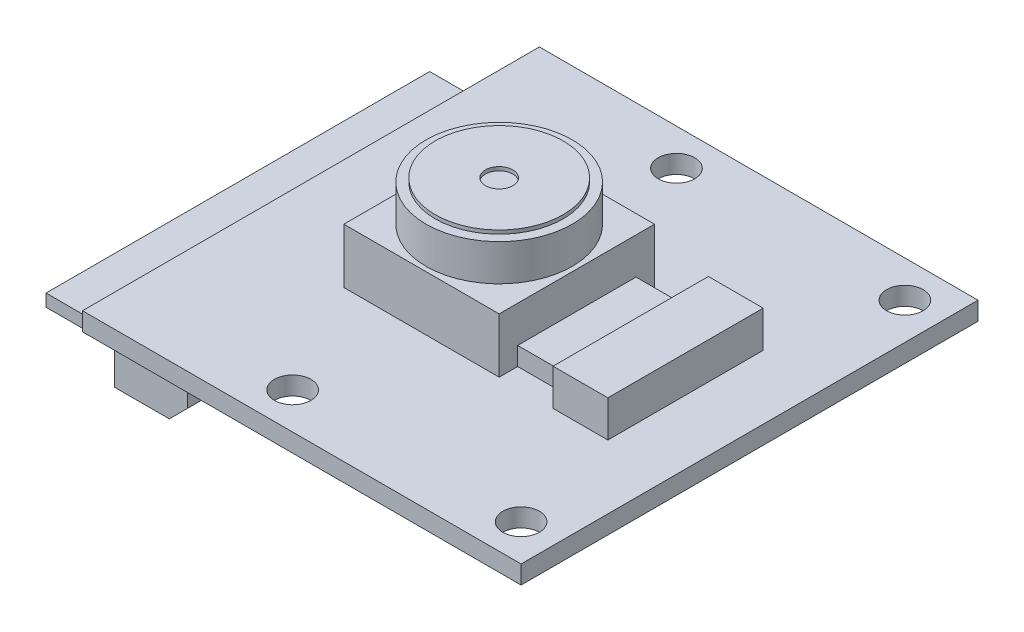
ISO-10303-21;
HEADER;
FILE_DESCRIPTION(('STEP AP214'),'2;1');
FILE_NAME('part.step','',(''),(''),'','','');
FILE_SCHEMA(('AUTOMOTIVE_DESIGN { 1 0 10303 214 1 1 1 1 }'));
ENDSEC;
DATA;
#1=APPLICATION_CONTEXT('core data for automotive mechanical design processes');
#2=APPLICATION_PROTOCOL_DEFINITION('international standard','automotive_design',2000,#1);
#3=PRODUCT_CONTEXT('',#1,'mechanical');
#4=PRODUCT('Part','Part','',(#3));
#5=PRODUCT_RELATED_PRODUCT_CATEGORY('part','',(#4));
#6=PRODUCT_DEFINITION_FORMATION('','',#4);
#7=PRODUCT_DEFINITION_CONTEXT('part definition',#1,'design');
#8=PRODUCT_DEFINITION('design','',#6,#7);
#9=PRODUCT_DEFINITION_SHAPE('','',#8);
#10=(LENGTH_UNIT() NAMED_UNIT(*) SI_UNIT(.MILLI.,.METRE.));
#11=(NAMED_UNIT(*) PLANE_ANGLE_UNIT() SI_UNIT($,.RADIAN.));
#12=(NAMED_UNIT(*) SI_UNIT($,.STERADIAN.) SOLID_ANGLE_UNIT());
#13=UNCERTAINTY_MEASURE_WITH_UNIT(LENGTH_MEASURE(1.E-05),#10,'distance_accuracy_value','');
#14=(GEOMETRIC_REPRESENTATION_CONTEXT(3) GLOBAL_UNCERTAINTY_ASSIGNED_CONTEXT((#13)) GLOBAL_UNIT_ASSIGNED_CONTEXT((#10,
#11,#12)) REPRESENTATION_CONTEXT('',''));
#15=CARTESIAN_POINT('',(0.,0.,0.));
#16=DIRECTION('',(0.,0.,1.));
#17=DIRECTION('',(1.,0.,0.));
#18=AXIS2_PLACEMENT_3D('',#15,#16,#17);
#19=CARTESIAN_POINT('',(-11.,-2.5,11.75));
#20=DIRECTION('',(-1.,0.,0.));
#21=DIRECTION('',(0.,0.,1.));
#22=AXIS2_PLACEMENT_3D('',#19,#20,#21);
#23=PLANE('',#22);
#24=DIRECTION('',(0.,0.,1.));
#25=VECTOR('',#24,1.);
#26=CARTESIAN_POINT('',(-11.,0.,11.75));
#27=LINE('',#26,#25);
#28=CARTESIAN_POINT('',(-11.,0.,-11.75));
#29=VERTEX_POINT('',#28);
#30=CARTESIAN_POINT('',(-11.,0.,11.75));
#31=VERTEX_POINT('',#30);
#32=EDGE_CURVE('E228',#29,#31,#27,.T.);
#33=ORIENTED_EDGE('',*,*,#32,.F.);
#34=DIRECTION('',(0.,1.,0.));
#35=VECTOR('',#34,1.);
#36=CARTESIAN_POINT('',(-11.,-2.5,-11.75));
#37=LINE('',#36,#35);
#38=CARTESIAN_POINT('',(-11.,-2.5,-11.75));
#39=VERTEX_POINT('',#38);
#40=EDGE_CURVE('E252',#39,#29,#37,.T.);
#41=ORIENTED_EDGE('',*,*,#40,.F.);
#42=DIRECTION('',(0.,0.,1.));
#43=VECTOR('',#42,1.);
#44=CARTESIAN_POINT('',(-11.,-2.5,11.75));
#45=LINE('',#44,#43);
#46=CARTESIAN_POINT('',(-11.,-2.5,11.75));
#47=VERTEX_POINT('',#46);
#48=EDGE_CURVE('E236',#39,#47,#45,.T.);
#49=ORIENTED_EDGE('',*,*,#48,.T.);
#50=DIRECTION('',(0.,1.,0.));
#51=VECTOR('',#50,1.);
#52=CARTESIAN_POINT('',(-11.,-2.5,11.75));
#53=LINE('',#52,#51);
#54=EDGE_CURVE('E243',#47,#31,#53,.T.);
#55=ORIENTED_EDGE('',*,*,#54,.T.);
#56=EDGE_LOOP('',(#33,#41,#49,#55));
#57=FACE_BOUND('',#56,.T.);
#58=DIRECTION('',(0.,0.,1.));
#59=VECTOR('',#58,1.);
#60=CARTESIAN_POINT('',(-11.,-1.83652307247097,10.4967751313598));
#61=LINE('',#60,#59);
#62=CARTESIAN_POINT('',(-11.,-1.83652307247097,-10.4967751313598));
#63=VERTEX_POINT('',#62);
#64=CARTESIAN_POINT('',(-11.,-1.83652307247097,10.4967751313598));
#65=VERTEX_POINT('',#64);
#66=EDGE_CURVE('E588',#63,#65,#61,.T.);
#67=ORIENTED_EDGE('',*,*,#66,.F.);
#68=DIRECTION('',(0.,-1.,0.));
#69=VECTOR('',#68,1.);
#70=CARTESIAN_POINT('',(-11.,-1.83652307247097,-10.4967751313598));
#71=LINE('',#70,#69);
#72=CARTESIAN_POINT('',(-11.,-1.16347692752903,-10.4967751313598));
#73=VERTEX_POINT('',#72);
#74=EDGE_CURVE('E226',#73,#63,#71,.T.);
#75=ORIENTED_EDGE('',*,*,#74,.F.);
#76=DIRECTION('',(0.,0.,-1.));
#77=VECTOR('',#76,1.);
#78=CARTESIAN_POINT('',(-11.,-1.16347692752903,10.4967751313598));
#79=LINE('',#78,#77);
#80=CARTESIAN_POINT('',(-11.,-1.16347692752903,10.4967751313598));
#81=VERTEX_POINT('',#80);
#82=EDGE_CURVE('E222',#81,#73,#79,.T.);
#83=ORIENTED_EDGE('',*,*,#82,.F.);
#84=DIRECTION('',(0.,1.,0.));
#85=VECTOR('',#84,1.);
#86=CARTESIAN_POINT('',(-11.,-1.83652307247097,10.4967751313598));
#87=LINE('',#86,#85);
#88=EDGE_CURVE('E590',#65,#81,#87,.T.);
#89=ORIENTED_EDGE('',*,*,#88,.F.);
#90=EDGE_LOOP('',(#67,#75,#83,#89));
#91=FACE_BOUND('',#90,.T.);
#92=ADVANCED_FACE('F33',(#57,#91),#23,.T.);
#93=CARTESIAN_POINT('',(0.,1.,0.));
#94=DIRECTION('',(0.,1.,0.));
#95=DIRECTION('',(0.,0.,1.));
#96=AXIS2_PLACEMENT_3D('',#93,#94,#95);
#97=PLANE('',#96);
#98=CARTESIAN_POINT('',(-2.5,1.,10.5));
#99=DIRECTION('',(0.,1.,0.));
#100=DIRECTION('',(0.,0.,1.));
#101=AXIS2_PLACEMENT_3D('',#98,#99,#100);
#102=CIRCLE('',#101,1.);
#103=CARTESIAN_POINT('',(-2.5,1.,11.5));
#104=VERTEX_POINT('',#103);
#105=EDGE_CURVE('E571',#104,#104,#102,.T.);
#106=ORIENTED_EDGE('',*,*,#105,.F.);
#107=EDGE_LOOP('',(#106));
#108=FACE_BOUND('',#107,.T.);
#109=CARTESIAN_POINT('',(10.,1.,-10.5));
#110=DIRECTION('',(0.,1.,0.));
#111=DIRECTION('',(0.,0.,1.));
#112=AXIS2_PLACEMENT_3D('',#109,#110,#111);
#113=CIRCLE('',#112,0.999999999999999);
#114=CARTESIAN_POINT('',(10.,1.,-9.5));
#115=VERTEX_POINT('',#114);
#116=EDGE_CURVE('E564',#115,#115,#113,.T.);
#117=ORIENTED_EDGE('',*,*,#116,.F.);
#118=EDGE_LOOP('',(#117));
#119=FACE_BOUND('',#118,.T.);
#120=CARTESIAN_POINT('',(-2.5,1.,-10.5));
#121=DIRECTION('',(0.,1.,0.));
#122=DIRECTION('',(0.,0.,1.));
#123=AXIS2_PLACEMENT_3D('',#120,#121,#122);
#124=CIRCLE('',#123,1.);
#125=CARTESIAN_POINT('',(-2.5,1.,-9.49999999999999));
#126=VERTEX_POINT('',#125);
#127=EDGE_CURVE('E556',#126,#126,#124,.T.);
#128=ORIENTED_EDGE('',*,*,#127,.F.);
#129=EDGE_LOOP('',(#128));
#130=FACE_BOUND('',#129,.T.);
#131=CARTESIAN_POINT('',(10.,1.,10.5));
#132=DIRECTION('',(0.,1.,0.));
#133=DIRECTION('',(0.,0.,1.));
#134=AXIS2_PLACEMENT_3D('',#131,#132,#133);
#135=CIRCLE('',#134,0.999999999999999);
#136=CARTESIAN_POINT('',(10.,1.,11.5));
#137=VERTEX_POINT('',#136);
#138=EDGE_CURVE('E570',#137,#137,#135,.T.);
#139=ORIENTED_EDGE('',*,*,#138,.F.);
#140=EDGE_LOOP('',(#139));
#141=FACE_BOUND('',#140,.T.);
#142=DIRECTION('',(0.,0.,-1.));
#143=VECTOR('',#142,1.);
#144=CARTESIAN_POINT('',(12.,1.,-12.5));
#145=LINE('',#144,#143);
#146=CARTESIAN_POINT('',(12.,1.,12.5));
#147=VERTEX_POINT('',#146);
#148=CARTESIAN_POINT('',(12.,1.,-12.5));
#149=VERTEX_POINT('',#148);
#150=EDGE_CURVE('E357',#147,#149,#145,.T.);
#151=ORIENTED_EDGE('',*,*,#150,.T.);
#152=DIRECTION('',(-1.,0.,0.));
#153=VECTOR('',#152,1.);
#154=CARTESIAN_POINT('',(-12.,1.,-12.5));
#155=LINE('',#154,#153);
#156=CARTESIAN_POINT('',(-12.,1.,-12.5));
#157=VERTEX_POINT('',#156);
#158=EDGE_CURVE('E360',#149,#157,#155,.T.);
#159=ORIENTED_EDGE('',*,*,#158,.T.);
#160=DIRECTION('',(0.,0.,1.));
#161=VECTOR('',#160,1.);
#162=CARTESIAN_POINT('',(-12.,1.,-12.5));
#163=LINE('',#162,#161);
#164=CARTESIAN_POINT('',(-12.,1.,12.5));
#165=VERTEX_POINT('',#164);
#166=EDGE_CURVE('E363',#157,#165,#163,.T.);
#167=ORIENTED_EDGE('',*,*,#166,.T.);
#168=DIRECTION('',(1.,0.,0.));
#169=VECTOR('',#168,1.);
#170=CARTESIAN_POINT('',(-12.,1.,12.5));
#171=LINE('',#170,#169);
#172=EDGE_CURVE('E365',#165,#147,#171,.T.);
#173=ORIENTED_EDGE('',*,*,#172,.T.);
#174=EDGE_LOOP('',(#151,#159,#167,#173));
#175=FACE_BOUND('',#174,.T.);
#176=DIRECTION('',(0.,0.,1.));
#177=VECTOR('',#176,1.);
#178=CARTESIAN_POINT('',(5.5,1.,4.2541908743633));
#179=LINE('',#178,#177);
#180=CARTESIAN_POINT('',(5.5,1.,3.2380612751322));
#181=VERTEX_POINT('',#180);
#182=CARTESIAN_POINT('',(5.5,1.,4.2541908743633));
#183=VERTEX_POINT('',#182);
#184=EDGE_CURVE('E299',#181,#183,#179,.T.);
#185=ORIENTED_EDGE('',*,*,#184,.F.);
#186=DIRECTION('',(1.,0.,0.));
#187=VECTOR('',#186,1.);
#188=CARTESIAN_POINT('',(2.55000000000001,1.,3.2380612751322));
#189=LINE('',#188,#187);
#190=CARTESIAN_POINT('',(2.55000000000001,1.,3.2380612751322));
#191=VERTEX_POINT('',#190);
#192=EDGE_CURVE('E254',#191,#181,#189,.T.);
#193=ORIENTED_EDGE('',*,*,#192,.F.);
#194=DIRECTION('',(0.,0.,-1.));
#195=VECTOR('',#194,1.);
#196=CARTESIAN_POINT('',(2.55000000000001,1.,4.25));
#197=LINE('',#196,#195);
#198=CARTESIAN_POINT('',(2.55000000000001,1.,4.25));
#199=VERTEX_POINT('',#198);
#200=EDGE_CURVE('E334',#199,#191,#197,.T.);
#201=ORIENTED_EDGE('',*,*,#200,.F.);
#202=DIRECTION('',(1.,0.,0.));
#203=VECTOR('',#202,1.);
#204=CARTESIAN_POINT('',(-5.94999999999999,1.,4.25));
#205=LINE('',#204,#203);
#206=CARTESIAN_POINT('',(-5.94999999999999,1.,4.25));
#207=VERTEX_POINT('',#206);
#208=EDGE_CURVE('E327',#207,#199,#205,.T.);
#209=ORIENTED_EDGE('',*,*,#208,.F.);
#210=DIRECTION('',(0.,0.,1.));
#211=VECTOR('',#210,1.);
#212=CARTESIAN_POINT('',(-5.94999999999999,1.,4.25));
#213=LINE('',#212,#211);
#214=CARTESIAN_POINT('',(-5.94999999999999,1.,-4.25));
#215=VERTEX_POINT('',#214);
#216=EDGE_CURVE('E340',#215,#207,#213,.T.);
#217=ORIENTED_EDGE('',*,*,#216,.F.);
#218=DIRECTION('',(-1.,0.,0.));
#219=VECTOR('',#218,1.);
#220=CARTESIAN_POINT('',(-5.94999999999999,1.,-4.25));
#221=LINE('',#220,#219);
#222=CARTESIAN_POINT('',(2.55000000000001,1.,-4.25));
#223=VERTEX_POINT('',#222);
#224=EDGE_CURVE('E337',#223,#215,#221,.T.);
#225=ORIENTED_EDGE('',*,*,#224,.F.);
#226=CARTESIAN_POINT('',(2.55000000000001,1.,-3.23806127513216));
#227=VERTEX_POINT('',#226);
#228=EDGE_CURVE('E317',#227,#223,#197,.T.);
#229=ORIENTED_EDGE('',*,*,#228,.F.);
#230=DIRECTION('',(-1.,0.,0.));
#231=VECTOR('',#230,1.);
#232=CARTESIAN_POINT('',(2.55000000000001,1.,-3.23806127513216));
#233=LINE('',#232,#231);
#234=CARTESIAN_POINT('',(5.5,1.,-3.23806127513216));
#235=VERTEX_POINT('',#234);
#236=EDGE_CURVE('E264',#235,#227,#233,.T.);
#237=ORIENTED_EDGE('',*,*,#236,.F.);
#238=CARTESIAN_POINT('',(5.5,1.,-4.2458091256367));
#239=VERTEX_POINT('',#238);
#240=EDGE_CURVE('E300',#239,#235,#179,.T.);
#241=ORIENTED_EDGE('',*,*,#240,.F.);
#242=DIRECTION('',(-1.,0.,0.));
#243=VECTOR('',#242,1.);
#244=CARTESIAN_POINT('',(5.5,1.,-4.2458091256367));
#245=LINE('',#244,#243);
#246=CARTESIAN_POINT('',(8.5,1.,-4.2458091256367));
#247=VERTEX_POINT('',#246);
#248=EDGE_CURVE('E297',#247,#239,#245,.T.);
#249=ORIENTED_EDGE('',*,*,#248,.F.);
#250=DIRECTION('',(0.,0.,-1.));
#251=VECTOR('',#250,1.);
#252=CARTESIAN_POINT('',(8.5,1.,4.2541908743633));
#253=LINE('',#252,#251);
#254=CARTESIAN_POINT('',(8.5,1.,4.2541908743633));
#255=VERTEX_POINT('',#254);
#256=EDGE_CURVE('E283',#255,#247,#253,.T.);
#257=ORIENTED_EDGE('',*,*,#256,.F.);
#258=DIRECTION('',(1.,0.,0.));
#259=VECTOR('',#258,1.);
#260=CARTESIAN_POINT('',(5.5,1.,4.2541908743633));
#261=LINE('',#260,#259);
#262=EDGE_CURVE('E288',#183,#255,#261,.T.);
#263=ORIENTED_EDGE('',*,*,#262,.F.);
#264=EDGE_LOOP('',(#185,#193,#201,#209,#217,#225,#229,#237,#241,#249,#257,#263));
#265=FACE_BOUND('',#264,.T.);
#266=ADVANCED_FACE('F434',(#108,#119,#130,#141,#175,#265),#97,.T.);
#267=CARTESIAN_POINT('',(2.55000000000001,4.,4.25));
#268=DIRECTION('',(-1.,0.,0.));
#269=DIRECTION('',(0.,0.,1.));
#270=AXIS2_PLACEMENT_3D('',#267,#268,#269);
#271=PLANE('',#270);
#272=DIRECTION('',(0.,-1.,0.));
#273=VECTOR('',#272,1.);
#274=CARTESIAN_POINT('',(2.55000000000001,2.,3.2380612751322));
#275=LINE('',#274,#273);
#276=CARTESIAN_POINT('',(2.55000000000001,2.,3.2380612751322));
#277=VERTEX_POINT('',#276);
#278=EDGE_CURVE('E281',#277,#191,#275,.T.);
#279=ORIENTED_EDGE('',*,*,#278,.F.);
#280=DIRECTION('',(0.,0.,1.));
#281=VECTOR('',#280,1.);
#282=CARTESIAN_POINT('',(2.55000000000001,2.,-3.23806127513216));
#283=LINE('',#282,#281);
#284=CARTESIAN_POINT('',(2.55000000000001,2.,-3.23806127513216));
#285=VERTEX_POINT('',#284);
#286=EDGE_CURVE('E260',#285,#277,#283,.T.);
#287=ORIENTED_EDGE('',*,*,#286,.F.);
#288=DIRECTION('',(0.,-1.,0.));
#289=VECTOR('',#288,1.);
#290=CARTESIAN_POINT('',(2.55000000000001,2.,-3.23806127513216));
#291=LINE('',#290,#289);
#292=EDGE_CURVE('E271',#285,#227,#291,.T.);
#293=ORIENTED_EDGE('',*,*,#292,.T.);
#294=ORIENTED_EDGE('',*,*,#228,.T.);
#295=DIRECTION('',(0.,-1.,0.));
#296=VECTOR('',#295,1.);
#297=CARTESIAN_POINT('',(2.55000000000001,4.,-4.25));
#298=LINE('',#297,#296);
#299=CARTESIAN_POINT('',(2.55000000000001,4.,-4.25));
#300=VERTEX_POINT('',#299);
#301=EDGE_CURVE('E353',#300,#223,#298,.T.);
#302=ORIENTED_EDGE('',*,*,#301,.F.);
#303=DIRECTION('',(0.,0.,-1.));
#304=VECTOR('',#303,1.);
#305=CARTESIAN_POINT('',(2.55000000000001,4.,4.25));
#306=LINE('',#305,#304);
#307=CARTESIAN_POINT('',(2.55000000000001,4.,4.25));
#308=VERTEX_POINT('',#307);
#309=EDGE_CURVE('E323',#308,#300,#306,.T.);
#310=ORIENTED_EDGE('',*,*,#309,.F.);
#311=DIRECTION('',(0.,-1.,0.));
#312=VECTOR('',#311,1.);
#313=CARTESIAN_POINT('',(2.55000000000001,4.,4.25));
#314=LINE('',#313,#312);
#315=EDGE_CURVE('E333',#308,#199,#314,.T.);
#316=ORIENTED_EDGE('',*,*,#315,.T.);
#317=ORIENTED_EDGE('',*,*,#200,.T.);
#318=EDGE_LOOP('',(#279,#287,#293,#294,#302,#310,#316,#317));
#319=FACE_BOUND('',#318,.T.);
#320=ADVANCED_FACE('F437',(#319),#271,.F.);
#321=CARTESIAN_POINT('',(5.5,3.,4.2541908743633));
#322=DIRECTION('',(1.,0.,0.));
#323=DIRECTION('',(0.,0.,-1.));
#324=AXIS2_PLACEMENT_3D('',#321,#322,#323);
#325=PLANE('',#324);
#326=DIRECTION('',(0.,-1.,0.));
#327=VECTOR('',#326,1.);
#328=CARTESIAN_POINT('',(5.5,2.,3.2380612751322));
#329=LINE('',#328,#327);
#330=CARTESIAN_POINT('',(5.5,2.,3.2380612751322));
#331=VERTEX_POINT('',#330);
#332=EDGE_CURVE('E278',#331,#181,#329,.T.);
#333=ORIENTED_EDGE('',*,*,#332,.T.);
#334=ORIENTED_EDGE('',*,*,#184,.T.);
#335=DIRECTION('',(0.,-1.,0.));
#336=VECTOR('',#335,1.);
#337=CARTESIAN_POINT('',(5.5,3.,4.2541908743633));
#338=LINE('',#337,#336);
#339=CARTESIAN_POINT('',(5.5,3.,4.2541908743633));
#340=VERTEX_POINT('',#339);
#341=EDGE_CURVE('E306',#340,#183,#338,.T.);
#342=ORIENTED_EDGE('',*,*,#341,.F.);
#343=DIRECTION('',(0.,0.,1.));
#344=VECTOR('',#343,1.);
#345=CARTESIAN_POINT('',(5.5,3.,4.2541908743633));
#346=LINE('',#345,#344);
#347=CARTESIAN_POINT('',(5.5,3.,-4.2458091256367));
#348=VERTEX_POINT('',#347);
#349=EDGE_CURVE('E290',#348,#340,#346,.T.);
#350=ORIENTED_EDGE('',*,*,#349,.F.);
#351=DIRECTION('',(0.,-1.,0.));
#352=VECTOR('',#351,1.);
#353=CARTESIAN_POINT('',(5.5,3.,-4.2458091256367));
#354=LINE('',#353,#352);
#355=EDGE_CURVE('E309',#348,#239,#354,.T.);
#356=ORIENTED_EDGE('',*,*,#355,.T.);
#357=ORIENTED_EDGE('',*,*,#240,.T.);
#358=DIRECTION('',(0.,-1.,0.));
#359=VECTOR('',#358,1.);
#360=CARTESIAN_POINT('',(5.5,2.,-3.23806127513216));
#361=LINE('',#360,#359);
#362=CARTESIAN_POINT('',(5.5,2.,-3.23806127513216));
#363=VERTEX_POINT('',#362);
#364=EDGE_CURVE('E276',#363,#235,#361,.T.);
#365=ORIENTED_EDGE('',*,*,#364,.F.);
#366=DIRECTION('',(0.,0.,-1.));
#367=VECTOR('',#366,1.);
#368=CARTESIAN_POINT('',(5.5,2.,-3.23806127513216));
#369=LINE('',#368,#367);
#370=EDGE_CURVE('E267',#331,#363,#369,.T.);
#371=ORIENTED_EDGE('',*,*,#370,.F.);
#372=EDGE_LOOP('',(#333,#334,#342,#350,#356,#357,#365,#371));
#373=FACE_BOUND('',#372,.T.);
#374=ADVANCED_FACE('F446',(#373),#325,.F.);
#375=CARTESIAN_POINT('',(12.,1.,-12.5));
#376=DIRECTION('',(-1.,0.,0.));
#377=DIRECTION('',(0.,0.,1.));
#378=AXIS2_PLACEMENT_3D('',#375,#376,#377);
#379=PLANE('',#378);
#380=DIRECTION('',(0.,0.,-1.));
#381=VECTOR('',#380,1.);
#382=CARTESIAN_POINT('',(12.,0.,-12.5));
#383=LINE('',#382,#381);
#384=CARTESIAN_POINT('',(12.,0.,12.5));
#385=VERTEX_POINT('',#384);
#386=CARTESIAN_POINT('',(12.,0.,-12.5));
#387=VERTEX_POINT('',#386);
#388=EDGE_CURVE('E356',#385,#387,#383,.T.);
#389=ORIENTED_EDGE('',*,*,#388,.T.);
#390=DIRECTION('',(0.,-1.,0.));
#391=VECTOR('',#390,1.);
#392=CARTESIAN_POINT('',(12.,1.,-12.5));
#393=LINE('',#392,#391);
#394=EDGE_CURVE('E322',#149,#387,#393,.T.);
#395=ORIENTED_EDGE('',*,*,#394,.F.);
#396=ORIENTED_EDGE('',*,*,#150,.F.);
#397=DIRECTION('',(0.,-1.,0.));
#398=VECTOR('',#397,1.);
#399=CARTESIAN_POINT('',(12.,1.,12.5));
#400=LINE('',#399,#398);
#401=EDGE_CURVE('E367',#147,#385,#400,.T.);
#402=ORIENTED_EDGE('',*,*,#401,.T.);
#403=EDGE_LOOP('',(#389,#395,#396,#402));
#404=FACE_BOUND('',#403,.T.);
#405=ADVANCED_FACE('F421',(#404),#379,.F.);
#406=CARTESIAN_POINT('',(-12.,1.,-12.5));
#407=DIRECTION('',(0.,0.,1.));
#408=DIRECTION('',(1.,0.,0.));
#409=AXIS2_PLACEMENT_3D('',#406,#407,#408);
#410=PLANE('',#409);
#411=DIRECTION('',(-1.,0.,0.));
#412=VECTOR('',#411,1.);
#413=CARTESIAN_POINT('',(-12.,0.,-12.5));
#414=LINE('',#413,#412);
#415=CARTESIAN_POINT('',(-12.,0.,-12.5));
#416=VERTEX_POINT('',#415);
#417=EDGE_CURVE('E370',#387,#416,#414,.T.);
#418=ORIENTED_EDGE('',*,*,#417,.T.);
#419=DIRECTION('',(0.,-1.,0.));
#420=VECTOR('',#419,1.);
#421=CARTESIAN_POINT('',(-12.,1.,-12.5));
#422=LINE('',#421,#420);
#423=EDGE_CURVE('E380',#157,#416,#422,.T.);
#424=ORIENTED_EDGE('',*,*,#423,.F.);
#425=ORIENTED_EDGE('',*,*,#158,.F.);
#426=ORIENTED_EDGE('',*,*,#394,.T.);
#427=EDGE_LOOP('',(#418,#424,#425,#426));
#428=FACE_BOUND('',#427,.T.);
#429=ADVANCED_FACE('F432',(#428),#410,.F.);
#430=CARTESIAN_POINT('',(-12.,1.,-12.5));
#431=DIRECTION('',(1.,0.,0.));
#432=DIRECTION('',(0.,0.,-1.));
#433=AXIS2_PLACEMENT_3D('',#430,#431,#432);
#434=PLANE('',#433);
#435=DIRECTION('',(0.,0.,1.));
#436=VECTOR('',#435,1.);
#437=CARTESIAN_POINT('',(-12.,0.,-12.5));
#438=LINE('',#437,#436);
#439=CARTESIAN_POINT('',(-12.,0.,12.5));
#440=VERTEX_POINT('',#439);
#441=EDGE_CURVE('E372',#416,#440,#438,.T.);
#442=ORIENTED_EDGE('',*,*,#441,.T.);
#443=DIRECTION('',(0.,-1.,0.));
#444=VECTOR('',#443,1.);
#445=CARTESIAN_POINT('',(-12.,1.,12.5));
#446=LINE('',#445,#444);
#447=EDGE_CURVE('E377',#165,#440,#446,.T.);
#448=ORIENTED_EDGE('',*,*,#447,.F.);
#449=ORIENTED_EDGE('',*,*,#166,.F.);
#450=ORIENTED_EDGE('',*,*,#423,.T.);
#451=EDGE_LOOP('',(#442,#448,#449,#450));
#452=FACE_BOUND('',#451,.T.);
#453=ADVANCED_FACE('F429',(#452),#434,.F.);
#454=CARTESIAN_POINT('',(-12.,1.,12.5));
#455=DIRECTION('',(0.,0.,-1.));
#456=DIRECTION('',(-1.,0.,0.));
#457=AXIS2_PLACEMENT_3D('',#454,#455,#456);
#458=PLANE('',#457);
#459=DIRECTION('',(1.,0.,0.));
#460=VECTOR('',#459,1.);
#461=CARTESIAN_POINT('',(-12.,0.,12.5));
#462=LINE('',#461,#460);
#463=EDGE_CURVE('E361',#440,#385,#462,.T.);
#464=ORIENTED_EDGE('',*,*,#463,.T.);
#465=ORIENTED_EDGE('',*,*,#401,.F.);
#466=ORIENTED_EDGE('',*,*,#172,.F.);
#467=ORIENTED_EDGE('',*,*,#447,.T.);
#468=EDGE_LOOP('',(#464,#465,#466,#467));
#469=FACE_BOUND('',#468,.T.);
#470=ADVANCED_FACE('F413',(#469),#458,.F.);
#471=CARTESIAN_POINT('',(0.,0.,0.));
#472=DIRECTION('',(0.,1.,0.));
#473=DIRECTION('',(0.,0.,1.));
#474=AXIS2_PLACEMENT_3D('',#471,#472,#473);
#475=PLANE('',#474);
#476=CARTESIAN_POINT('',(-2.5,0.,10.5));
#477=DIRECTION('',(0.,1.,0.));
#478=DIRECTION('',(0.,0.,1.));
#479=AXIS2_PLACEMENT_3D('',#476,#477,#478);
#480=CIRCLE('',#479,1.);
#481=CARTESIAN_POINT('',(-2.5,0.,11.5));
#482=VERTEX_POINT('',#481);
#483=EDGE_CURVE('E567',#482,#482,#480,.T.);
#484=ORIENTED_EDGE('',*,*,#483,.T.);
#485=EDGE_LOOP('',(#484));
#486=FACE_BOUND('',#485,.T.);
#487=CARTESIAN_POINT('',(10.,0.,-10.5));
#488=DIRECTION('',(0.,1.,0.));
#489=DIRECTION('',(0.,0.,1.));
#490=AXIS2_PLACEMENT_3D('',#487,#488,#489);
#491=CIRCLE('',#490,0.999999999999999);
#492=CARTESIAN_POINT('',(10.,0.,-9.5));
#493=VERTEX_POINT('',#492);
#494=EDGE_CURVE('E574',#493,#493,#491,.T.);
#495=ORIENTED_EDGE('',*,*,#494,.T.);
#496=EDGE_LOOP('',(#495));
#497=FACE_BOUND('',#496,.T.);
#498=CARTESIAN_POINT('',(-2.5,0.,-10.5));
#499=DIRECTION('',(0.,1.,0.));
#500=DIRECTION('',(0.,0.,1.));
#501=AXIS2_PLACEMENT_3D('',#498,#499,#500);
#502=CIRCLE('',#501,1.);
#503=CARTESIAN_POINT('',(-2.5,0.,-9.49999999999999));
#504=VERTEX_POINT('',#503);
#505=EDGE_CURVE('E561',#504,#504,#502,.T.);
#506=ORIENTED_EDGE('',*,*,#505,.T.);
#507=EDGE_LOOP('',(#506));
#508=FACE_BOUND('',#507,.T.);
#509=CARTESIAN_POINT('',(10.,0.,10.5));
#510=DIRECTION('',(0.,1.,0.));
#511=DIRECTION('',(0.,0.,1.));
#512=AXIS2_PLACEMENT_3D('',#509,#510,#511);
#513=CIRCLE('',#512,0.999999999999999);
#514=CARTESIAN_POINT('',(10.,0.,11.5));
#515=VERTEX_POINT('',#514);
#516=EDGE_CURVE('E579',#515,#515,#513,.T.);
#517=ORIENTED_EDGE('',*,*,#516,.T.);
#518=EDGE_LOOP('',(#517));
#519=FACE_BOUND('',#518,.T.);
#520=DIRECTION('',(-1.,0.,0.));
#521=VECTOR('',#520,1.);
#522=CARTESIAN_POINT('',(-11.,0.,-11.75));
#523=LINE('',#522,#521);
#524=CARTESIAN_POINT('',(-7.,0.,-11.75));
#525=VERTEX_POINT('',#524);
#526=EDGE_CURVE('E240',#525,#29,#523,.T.);
#527=ORIENTED_EDGE('',*,*,#526,.T.);
#528=ORIENTED_EDGE('',*,*,#32,.T.);
#529=DIRECTION('',(1.,0.,0.));
#530=VECTOR('',#529,1.);
#531=CARTESIAN_POINT('',(-11.,0.,11.75));
#532=LINE('',#531,#530);
#533=CARTESIAN_POINT('',(-7.,0.,11.75));
#534=VERTEX_POINT('',#533);
#535=EDGE_CURVE('E231',#31,#534,#532,.T.);
#536=ORIENTED_EDGE('',*,*,#535,.T.);
#537=DIRECTION('',(0.,0.,-1.));
#538=VECTOR('',#537,1.);
#539=CARTESIAN_POINT('',(-7.,0.,11.75));
#540=LINE('',#539,#538);
#541=EDGE_CURVE('E247',#534,#525,#540,.T.);
#542=ORIENTED_EDGE('',*,*,#541,.T.);
#543=EDGE_LOOP('',(#527,#528,#536,#542));
#544=FACE_BOUND('',#543,.T.);
#545=ORIENTED_EDGE('',*,*,#388,.F.);
#546=ORIENTED_EDGE('',*,*,#463,.F.);
#547=ORIENTED_EDGE('',*,*,#441,.F.);
#548=ORIENTED_EDGE('',*,*,#417,.F.);
#549=EDGE_LOOP('',(#545,#546,#547,#548));
#550=FACE_BOUND('',#549,.T.);
#551=ADVANCED_FACE('F409',(#486,#497,#508,#519,#544,#550),#475,.F.);
#552=CARTESIAN_POINT('',(-5.94999999999999,4.,-4.25));
#553=DIRECTION('',(0.,0.,1.));
#554=DIRECTION('',(1.,0.,0.));
#555=AXIS2_PLACEMENT_3D('',#552,#553,#554);
#556=PLANE('',#555);
#557=ORIENTED_EDGE('',*,*,#224,.T.);
#558=DIRECTION('',(0.,-1.,0.));
#559=VECTOR('',#558,1.);
#560=CARTESIAN_POINT('',(-5.94999999999999,4.,-4.25));
#561=LINE('',#560,#559);
#562=CARTESIAN_POINT('',(-5.94999999999999,4.,-4.25));
#563=VERTEX_POINT('',#562);
#564=EDGE_CURVE('E350',#563,#215,#561,.T.);
#565=ORIENTED_EDGE('',*,*,#564,.F.);
#566=DIRECTION('',(-1.,0.,0.));
#567=VECTOR('',#566,1.);
#568=CARTESIAN_POINT('',(-5.94999999999999,4.,-4.25));
#569=LINE('',#568,#567);
#570=EDGE_CURVE('E326',#300,#563,#569,.T.);
#571=ORIENTED_EDGE('',*,*,#570,.F.);
#572=ORIENTED_EDGE('',*,*,#301,.T.);
#573=EDGE_LOOP('',(#557,#565,#571,#572));
#574=FACE_BOUND('',#573,.T.);
#575=ADVANCED_FACE('F412',(#574),#556,.F.);
#576=CARTESIAN_POINT('',(-5.94999999999999,4.,4.25));
#577=DIRECTION('',(1.,0.,0.));
#578=DIRECTION('',(0.,0.,-1.));
#579=AXIS2_PLACEMENT_3D('',#576,#577,#578);
#580=PLANE('',#579);
#581=ORIENTED_EDGE('',*,*,#216,.T.);
#582=DIRECTION('',(0.,-1.,0.));
#583=VECTOR('',#582,1.);
#584=CARTESIAN_POINT('',(-5.94999999999999,4.,4.25));
#585=LINE('',#584,#583);
#586=CARTESIAN_POINT('',(-5.94999999999999,4.,4.25));
#587=VERTEX_POINT('',#586);
#588=EDGE_CURVE('E347',#587,#207,#585,.T.);
#589=ORIENTED_EDGE('',*,*,#588,.F.);
#590=DIRECTION('',(0.,0.,1.));
#591=VECTOR('',#590,1.);
#592=CARTESIAN_POINT('',(-5.94999999999999,4.,4.25));
#593=LINE('',#592,#591);
#594=EDGE_CURVE('E329',#563,#587,#593,.T.);
#595=ORIENTED_EDGE('',*,*,#594,.F.);
#596=ORIENTED_EDGE('',*,*,#564,.T.);
#597=EDGE_LOOP('',(#581,#589,#595,#596));
#598=FACE_BOUND('',#597,.T.);
#599=ADVANCED_FACE('F646',(#598),#580,.F.);
#600=CARTESIAN_POINT('',(-5.94999999999999,4.,4.25));
#601=DIRECTION('',(0.,0.,-1.));
#602=DIRECTION('',(-1.,0.,0.));
#603=AXIS2_PLACEMENT_3D('',#600,#601,#602);
#604=PLANE('',#603);
#605=ORIENTED_EDGE('',*,*,#208,.T.);
#606=ORIENTED_EDGE('',*,*,#315,.F.);
#607=DIRECTION('',(1.,0.,0.));
#608=VECTOR('',#607,1.);
#609=CARTESIAN_POINT('',(-5.94999999999999,4.,4.25));
#610=LINE('',#609,#608);
#611=EDGE_CURVE('E331',#587,#308,#610,.T.);
#612=ORIENTED_EDGE('',*,*,#611,.F.);
#613=ORIENTED_EDGE('',*,*,#588,.T.);
#614=EDGE_LOOP('',(#605,#606,#612,#613));
#615=FACE_BOUND('',#614,.T.);
#616=ADVANCED_FACE('F636',(#615),#604,.F.);
#617=CARTESIAN_POINT('',(0.,4.,0.));
#618=DIRECTION('',(0.,-1.,0.));
#619=DIRECTION('',(0.,0.,-1.));
#620=AXIS2_PLACEMENT_3D('',#617,#618,#619);
#621=PLANE('',#620);
#622=CARTESIAN_POINT('',(-1.69999999999999,4.,0.));
#623=DIRECTION('',(0.,1.,0.));
#624=DIRECTION('',(0.,0.,1.));
#625=AXIS2_PLACEMENT_3D('',#622,#623,#624);
#626=CIRCLE('',#625,4.);
#627=CARTESIAN_POINT('',(-1.69999999999999,4.,4.));
#628=VERTEX_POINT('',#627);
#629=EDGE_CURVE('E318',#628,#628,#626,.T.);
#630=ORIENTED_EDGE('',*,*,#629,.F.);
#631=EDGE_LOOP('',(#630));
#632=FACE_BOUND('',#631,.T.);
#633=ORIENTED_EDGE('',*,*,#309,.T.);
#634=ORIENTED_EDGE('',*,*,#570,.T.);
#635=ORIENTED_EDGE('',*,*,#594,.T.);
#636=ORIENTED_EDGE('',*,*,#611,.T.);
#637=EDGE_LOOP('',(#633,#634,#635,#636));
#638=FACE_BOUND('',#637,.T.);
#639=ADVANCED_FACE('F630',(#632,#638),#621,.F.);
#640=CARTESIAN_POINT('',(-1.69999999999999,6.,0.));
#641=DIRECTION('',(0.,-1.,0.));
#642=DIRECTION('',(0.,0.,-1.));
#643=AXIS2_PLACEMENT_3D('',#640,#641,#642);
#644=CYLINDRICAL_SURFACE('',#643,4.);
#645=CARTESIAN_POINT('',(-1.69999999999999,6.,0.));
#646=DIRECTION('',(0.,1.,0.));
#647=DIRECTION('',(0.,0.,1.));
#648=AXIS2_PLACEMENT_3D('',#645,#646,#647);
#649=CIRCLE('',#648,4.);
#650=CARTESIAN_POINT('',(-1.69999999999999,6.,4.));
#651=VERTEX_POINT('',#650);
#652=EDGE_CURVE('E314',#651,#651,#649,.T.);
#653=ORIENTED_EDGE('',*,*,#652,.F.);
#654=EDGE_LOOP('',(#653));
#655=FACE_BOUND('',#654,.T.);
#656=ORIENTED_EDGE('',*,*,#629,.T.);
#657=EDGE_LOOP('',(#656));
#658=FACE_BOUND('',#657,.T.);
#659=ADVANCED_FACE('F624',(#655,#658),#644,.T.);
#660=CARTESIAN_POINT('',(-1.69999999999999,6.,0.));
#661=DIRECTION('',(0.,1.,0.));
#662=DIRECTION('',(0.,0.,1.));
#663=AXIS2_PLACEMENT_3D('',#660,#661,#662);
#664=PLANE('',#663);
#665=CARTESIAN_POINT('',(-1.69999999999999,6.,0.));
#666=DIRECTION('',(0.,1.,0.));
#667=DIRECTION('',(0.,0.,1.));
#668=AXIS2_PLACEMENT_3D('',#665,#666,#667);
#669=CIRCLE('',#668,3.5);
#670=CARTESIAN_POINT('',(-1.69999999999999,6.,3.5));
#671=VERTEX_POINT('',#670);
#672=EDGE_CURVE('E11',#671,#671,#669,.T.);
#673=ORIENTED_EDGE('',*,*,#672,.F.);
#674=EDGE_LOOP('',(#673));
#675=FACE_BOUND('',#674,.T.);
#676=ORIENTED_EDGE('',*,*,#652,.T.);
#677=EDGE_LOOP('',(#676));
#678=FACE_BOUND('',#677,.T.);
#679=ADVANCED_FACE('F620',(#675,#678),#664,.T.);
#680=CARTESIAN_POINT('',(8.5,3.,4.2541908743633));
#681=DIRECTION('',(-1.,0.,0.));
#682=DIRECTION('',(0.,0.,1.));
#683=AXIS2_PLACEMENT_3D('',#680,#681,#682);
#684=PLANE('',#683);
#685=ORIENTED_EDGE('',*,*,#256,.T.);
#686=DIRECTION('',(0.,-1.,0.));
#687=VECTOR('',#686,1.);
#688=CARTESIAN_POINT('',(8.5,3.,-4.2458091256367));
#689=LINE('',#688,#687);
#690=CARTESIAN_POINT('',(8.5,3.,-4.2458091256367));
#691=VERTEX_POINT('',#690);
#692=EDGE_CURVE('E312',#691,#247,#689,.T.);
#693=ORIENTED_EDGE('',*,*,#692,.F.);
#694=DIRECTION('',(0.,0.,-1.));
#695=VECTOR('',#694,1.);
#696=CARTESIAN_POINT('',(8.5,3.,4.2541908743633));
#697=LINE('',#696,#695);
#698=CARTESIAN_POINT('',(8.5,3.,4.2541908743633));
#699=VERTEX_POINT('',#698);
#700=EDGE_CURVE('E284',#699,#691,#697,.T.);
#701=ORIENTED_EDGE('',*,*,#700,.F.);
#702=DIRECTION('',(0.,-1.,0.));
#703=VECTOR('',#702,1.);
#704=CARTESIAN_POINT('',(8.5,3.,4.2541908743633));
#705=LINE('',#704,#703);
#706=EDGE_CURVE('E294',#699,#255,#705,.T.);
#707=ORIENTED_EDGE('',*,*,#706,.T.);
#708=EDGE_LOOP('',(#685,#693,#701,#707));
#709=FACE_BOUND('',#708,.T.);
#710=ADVANCED_FACE('F623',(#709),#684,.F.);
#711=CARTESIAN_POINT('',(5.5,3.,-4.2458091256367));
#712=DIRECTION('',(0.,0.,1.));
#713=DIRECTION('',(1.,0.,0.));
#714=AXIS2_PLACEMENT_3D('',#711,#712,#713);
#715=PLANE('',#714);
#716=ORIENTED_EDGE('',*,*,#248,.T.);
#717=ORIENTED_EDGE('',*,*,#355,.F.);
#718=DIRECTION('',(-1.,0.,0.));
#719=VECTOR('',#718,1.);
#720=CARTESIAN_POINT('',(5.5,3.,-4.2458091256367));
#721=LINE('',#720,#719);
#722=EDGE_CURVE('E287',#691,#348,#721,.T.);
#723=ORIENTED_EDGE('',*,*,#722,.F.);
#724=ORIENTED_EDGE('',*,*,#692,.T.);
#725=EDGE_LOOP('',(#716,#717,#723,#724));
#726=FACE_BOUND('',#725,.T.);
#727=ADVANCED_FACE('F673',(#726),#715,.F.);
#728=CARTESIAN_POINT('',(5.5,3.,4.2541908743633));
#729=DIRECTION('',(0.,0.,-1.));
#730=DIRECTION('',(-1.,0.,0.));
#731=AXIS2_PLACEMENT_3D('',#728,#729,#730);
#732=PLANE('',#731);
#733=ORIENTED_EDGE('',*,*,#262,.T.);
#734=ORIENTED_EDGE('',*,*,#706,.F.);
#735=DIRECTION('',(1.,0.,0.));
#736=VECTOR('',#735,1.);
#737=CARTESIAN_POINT('',(5.5,3.,4.2541908743633));
#738=LINE('',#737,#736);
#739=EDGE_CURVE('E292',#340,#699,#738,.T.);
#740=ORIENTED_EDGE('',*,*,#739,.F.);
#741=ORIENTED_EDGE('',*,*,#341,.T.);
#742=EDGE_LOOP('',(#733,#734,#740,#741));
#743=FACE_BOUND('',#742,.T.);
#744=ADVANCED_FACE('F451',(#743),#732,.F.);
#745=CARTESIAN_POINT('',(0.,3.,0.));
#746=DIRECTION('',(0.,-1.,0.));
#747=DIRECTION('',(0.,0.,-1.));
#748=AXIS2_PLACEMENT_3D('',#745,#746,#747);
#749=PLANE('',#748);
#750=ORIENTED_EDGE('',*,*,#700,.T.);
#751=ORIENTED_EDGE('',*,*,#722,.T.);
#752=ORIENTED_EDGE('',*,*,#349,.T.);
#753=ORIENTED_EDGE('',*,*,#739,.T.);
#754=EDGE_LOOP('',(#750,#751,#752,#753));
#755=FACE_BOUND('',#754,.T.);
#756=ADVANCED_FACE('F455',(#755),#749,.F.);
#757=CARTESIAN_POINT('',(2.55000000000001,2.,3.2380612751322));
#758=DIRECTION('',(0.,0.,-1.));
#759=DIRECTION('',(-1.,0.,0.));
#760=AXIS2_PLACEMENT_3D('',#757,#758,#759);
#761=PLANE('',#760);
#762=ORIENTED_EDGE('',*,*,#192,.T.);
#763=ORIENTED_EDGE('',*,*,#332,.F.);
#764=DIRECTION('',(1.,0.,0.));
#765=VECTOR('',#764,1.);
#766=CARTESIAN_POINT('',(2.55000000000001,2.,3.2380612751322));
#767=LINE('',#766,#765);
#768=EDGE_CURVE('E263',#277,#331,#767,.T.);
#769=ORIENTED_EDGE('',*,*,#768,.F.);
#770=ORIENTED_EDGE('',*,*,#278,.T.);
#771=EDGE_LOOP('',(#762,#763,#769,#770));
#772=FACE_BOUND('',#771,.T.);
#773=ADVANCED_FACE('F476',(#772),#761,.F.);
#774=CARTESIAN_POINT('',(2.55000000000001,2.,-3.23806127513216));
#775=DIRECTION('',(0.,0.,1.));
#776=DIRECTION('',(1.,0.,0.));
#777=AXIS2_PLACEMENT_3D('',#774,#775,#776);
#778=PLANE('',#777);
#779=ORIENTED_EDGE('',*,*,#236,.T.);
#780=ORIENTED_EDGE('',*,*,#292,.F.);
#781=DIRECTION('',(-1.,0.,0.));
#782=VECTOR('',#781,1.);
#783=CARTESIAN_POINT('',(2.55000000000001,2.,-3.23806127513216));
#784=LINE('',#783,#782);
#785=EDGE_CURVE('E269',#363,#285,#784,.T.);
#786=ORIENTED_EDGE('',*,*,#785,.F.);
#787=ORIENTED_EDGE('',*,*,#364,.T.);
#788=EDGE_LOOP('',(#779,#780,#786,#787));
#789=FACE_BOUND('',#788,.T.);
#790=ADVANCED_FACE('F467',(#789),#778,.F.);
#791=CARTESIAN_POINT('',(0.,2.,0.));
#792=DIRECTION('',(0.,1.,0.));
#793=DIRECTION('',(0.,0.,1.));
#794=AXIS2_PLACEMENT_3D('',#791,#792,#793);
#795=PLANE('',#794);
#796=ORIENTED_EDGE('',*,*,#286,.T.);
#797=ORIENTED_EDGE('',*,*,#768,.T.);
#798=ORIENTED_EDGE('',*,*,#370,.T.);
#799=ORIENTED_EDGE('',*,*,#785,.T.);
#800=EDGE_LOOP('',(#796,#797,#798,#799));
#801=FACE_BOUND('',#800,.T.);
#802=ADVANCED_FACE('F474',(#801),#795,.T.);
#803=CARTESIAN_POINT('',(-11.,-2.5,-11.75));
#804=DIRECTION('',(0.,0.,-1.));
#805=DIRECTION('',(-1.,0.,0.));
#806=AXIS2_PLACEMENT_3D('',#803,#804,#805);
#807=PLANE('',#806);
#808=DIRECTION('',(0.,1.,0.));
#809=VECTOR('',#808,1.);
#810=CARTESIAN_POINT('',(-7.,-2.5,-11.75));
#811=LINE('',#810,#809);
#812=CARTESIAN_POINT('',(-7.,-1.5,-11.75));
#813=VERTEX_POINT('',#812);
#814=EDGE_CURVE('E255',#813,#525,#811,.T.);
#815=ORIENTED_EDGE('',*,*,#814,.F.);
#816=DIRECTION('',(0.707106781186549,0.707106781186546,0.));
#817=VECTOR('',#816,1.);
#818=CARTESIAN_POINT('',(-9.50000000000001,-4.,-11.75));
#819=LINE('',#818,#817);
#820=CARTESIAN_POINT('',(-8.00000000000001,-2.5,-11.75));
#821=VERTEX_POINT('',#820);
#822=EDGE_CURVE('E387',#813,#821,#819,.F.);
#823=ORIENTED_EDGE('',*,*,#822,.T.);
#824=DIRECTION('',(-1.,0.,0.));
#825=VECTOR('',#824,1.);
#826=CARTESIAN_POINT('',(-11.,-2.5,-11.75));
#827=LINE('',#826,#825);
#828=EDGE_CURVE('E242',#821,#39,#827,.T.);
#829=ORIENTED_EDGE('',*,*,#828,.T.);
#830=ORIENTED_EDGE('',*,*,#40,.T.);
#831=ORIENTED_EDGE('',*,*,#526,.F.);
#832=EDGE_LOOP('',(#815,#823,#829,#830,#831));
#833=FACE_BOUND('',#832,.T.);
#834=ADVANCED_FACE('F400',(#833),#807,.T.);
#835=CARTESIAN_POINT('',(-7.,-2.5,11.75));
#836=DIRECTION('',(1.,0.,0.));
#837=DIRECTION('',(0.,0.,-1.));
#838=AXIS2_PLACEMENT_3D('',#835,#836,#837);
#839=PLANE('',#838);
#840=DIRECTION('',(0.,1.,0.));
#841=VECTOR('',#840,1.);
#842=CARTESIAN_POINT('',(-7.,-2.5,11.75));
#843=LINE('',#842,#841);
#844=CARTESIAN_POINT('',(-7.,-1.5,11.75));
#845=VERTEX_POINT('',#844);
#846=EDGE_CURVE('E257',#845,#534,#843,.T.);
#847=ORIENTED_EDGE('',*,*,#846,.F.);
#848=DIRECTION('',(0.,0.,-1.));
#849=VECTOR('',#848,1.);
#850=CARTESIAN_POINT('',(-7.,-1.5,11.75));
#851=LINE('',#850,#849);
#852=EDGE_CURVE('E321',#845,#813,#851,.T.);
#853=ORIENTED_EDGE('',*,*,#852,.T.);
#854=ORIENTED_EDGE('',*,*,#814,.T.);
#855=ORIENTED_EDGE('',*,*,#541,.F.);
#856=EDGE_LOOP('',(#847,#853,#854,#855));
#857=FACE_BOUND('',#856,.T.);
#858=ADVANCED_FACE('F397',(#857),#839,.T.);
#859=CARTESIAN_POINT('',(-11.,-2.5,11.75));
#860=DIRECTION('',(0.,0.,1.));
#861=DIRECTION('',(1.,0.,0.));
#862=AXIS2_PLACEMENT_3D('',#859,#860,#861);
#863=PLANE('',#862);
#864=DIRECTION('',(1.,0.,0.));
#865=VECTOR('',#864,1.);
#866=CARTESIAN_POINT('',(-11.,-2.5,11.75));
#867=LINE('',#866,#865);
#868=CARTESIAN_POINT('',(-8.00000000000001,-2.5,11.75));
#869=VERTEX_POINT('',#868);
#870=EDGE_CURVE('E239',#47,#869,#867,.T.);
#871=ORIENTED_EDGE('',*,*,#870,.T.);
#872=DIRECTION('',(-0.707106781186549,-0.707106781186546,0.));
#873=VECTOR('',#872,1.);
#874=CARTESIAN_POINT('',(-9.50000000000001,-4.,11.75));
#875=LINE('',#874,#873);
#876=EDGE_CURVE('E37',#869,#845,#875,.F.);
#877=ORIENTED_EDGE('',*,*,#876,.T.);
#878=ORIENTED_EDGE('',*,*,#846,.T.);
#879=ORIENTED_EDGE('',*,*,#535,.F.);
#880=ORIENTED_EDGE('',*,*,#54,.F.);
#881=EDGE_LOOP('',(#871,#877,#878,#879,#880));
#882=FACE_BOUND('',#881,.T.);
#883=ADVANCED_FACE('F391',(#882),#863,.T.);
#884=CARTESIAN_POINT('',(0.,-2.5,0.));
#885=DIRECTION('',(0.,-1.,0.));
#886=DIRECTION('',(0.,0.,-1.));
#887=AXIS2_PLACEMENT_3D('',#884,#885,#886);
#888=PLANE('',#887);
#889=ORIENTED_EDGE('',*,*,#828,.F.);
#890=DIRECTION('',(0.,0.,1.));
#891=VECTOR('',#890,1.);
#892=CARTESIAN_POINT('',(-8.00000000000001,-2.5,0.));
#893=LINE('',#892,#891);
#894=EDGE_CURVE('E57',#821,#869,#893,.T.);
#895=ORIENTED_EDGE('',*,*,#894,.T.);
#896=ORIENTED_EDGE('',*,*,#870,.F.);
#897=ORIENTED_EDGE('',*,*,#48,.F.);
#898=EDGE_LOOP('',(#889,#895,#896,#897));
#899=FACE_BOUND('',#898,.T.);
#900=ADVANCED_FACE('F404',(#899),#888,.T.);
#901=CARTESIAN_POINT('',(-7.,-1.5,11.75));
#902=DIRECTION('',(-0.707106781186546,0.707106781186549,0.));
#903=DIRECTION('',(0.,0.,-1.));
#904=AXIS2_PLACEMENT_3D('',#901,#902,#903);
#905=PLANE('',#904);
#906=ORIENTED_EDGE('',*,*,#876,.F.);
#907=ORIENTED_EDGE('',*,*,#894,.F.);
#908=ORIENTED_EDGE('',*,*,#822,.F.);
#909=ORIENTED_EDGE('',*,*,#852,.F.);
#910=EDGE_LOOP('',(#906,#907,#908,#909));
#911=FACE_BOUND('',#910,.T.);
#912=ADVANCED_FACE('F35',(#911),#905,.F.);
#913=CARTESIAN_POINT('',(-16.,-1.83652307247097,-10.4967751313598));
#914=DIRECTION('',(0.,0.,1.));
#915=DIRECTION('',(1.,0.,0.));
#916=AXIS2_PLACEMENT_3D('',#913,#914,#915);
#917=PLANE('',#916);
#918=ORIENTED_EDGE('',*,*,#74,.T.);
#919=DIRECTION('',(1.,0.,0.));
#920=VECTOR('',#919,1.);
#921=CARTESIAN_POINT('',(-16.,-1.83652307247097,-10.4967751313598));
#922=LINE('',#921,#920);
#923=CARTESIAN_POINT('',(-16.,-1.83652307247097,-10.4967751313598));
#924=VERTEX_POINT('',#923);
#925=EDGE_CURVE('E207',#924,#63,#922,.T.);
#926=ORIENTED_EDGE('',*,*,#925,.F.);
#927=DIRECTION('',(0.,-1.,0.));
#928=VECTOR('',#927,1.);
#929=CARTESIAN_POINT('',(-16.,-1.83652307247097,-10.4967751313598));
#930=LINE('',#929,#928);
#931=CARTESIAN_POINT('',(-16.,-1.16347692752903,-10.4967751313598));
#932=VERTEX_POINT('',#931);
#933=EDGE_CURVE('E214',#932,#924,#930,.T.);
#934=ORIENTED_EDGE('',*,*,#933,.F.);
#935=DIRECTION('',(1.,0.,0.));
#936=VECTOR('',#935,1.);
#937=CARTESIAN_POINT('',(-16.,-1.16347692752903,-10.4967751313598));
#938=LINE('',#937,#936);
#939=EDGE_CURVE('E586',#932,#73,#938,.T.);
#940=ORIENTED_EDGE('',*,*,#939,.T.);
#941=EDGE_LOOP('',(#918,#926,#934,#940));
#942=FACE_BOUND('',#941,.T.);
#943=ADVANCED_FACE('F224',(#942),#917,.F.);
#944=CARTESIAN_POINT('',(-16.,-1.83652307247097,10.4967751313598));
#945=DIRECTION('',(0.,1.,0.));
#946=DIRECTION('',(0.,0.,1.));
#947=AXIS2_PLACEMENT_3D('',#944,#945,#946);
#948=PLANE('',#947);
#949=ORIENTED_EDGE('',*,*,#66,.T.);
#950=DIRECTION('',(1.,0.,0.));
#951=VECTOR('',#950,1.);
#952=CARTESIAN_POINT('',(-16.,-1.83652307247097,10.4967751313598));
#953=LINE('',#952,#951);
#954=CARTESIAN_POINT('',(-16.,-1.83652307247097,10.4967751313598));
#955=VERTEX_POINT('',#954);
#956=EDGE_CURVE('E210',#955,#65,#953,.T.);
#957=ORIENTED_EDGE('',*,*,#956,.F.);
#958=DIRECTION('',(0.,0.,1.));
#959=VECTOR('',#958,1.);
#960=CARTESIAN_POINT('',(-16.,-1.83652307247097,10.4967751313598));
#961=LINE('',#960,#959);
#962=EDGE_CURVE('E203',#924,#955,#961,.T.);
#963=ORIENTED_EDGE('',*,*,#962,.F.);
#964=ORIENTED_EDGE('',*,*,#925,.T.);
#965=EDGE_LOOP('',(#949,#957,#963,#964));
#966=FACE_BOUND('',#965,.T.);
#967=ADVANCED_FACE('F205',(#966),#948,.F.);
#968=CARTESIAN_POINT('',(-16.,-1.83652307247097,10.4967751313598));
#969=DIRECTION('',(0.,0.,-1.));
#970=DIRECTION('',(-1.,0.,0.));
#971=AXIS2_PLACEMENT_3D('',#968,#969,#970);
#972=PLANE('',#971);
#973=ORIENTED_EDGE('',*,*,#88,.T.);
#974=DIRECTION('',(1.,0.,0.));
#975=VECTOR('',#974,1.);
#976=CARTESIAN_POINT('',(-16.,-1.16347692752903,10.4967751313598));
#977=LINE('',#976,#975);
#978=CARTESIAN_POINT('',(-16.,-1.16347692752903,10.4967751313598));
#979=VERTEX_POINT('',#978);
#980=EDGE_CURVE('E49',#979,#81,#977,.T.);
#981=ORIENTED_EDGE('',*,*,#980,.F.);
#982=DIRECTION('',(0.,1.,0.));
#983=VECTOR('',#982,1.);
#984=CARTESIAN_POINT('',(-16.,-1.83652307247097,10.4967751313598));
#985=LINE('',#984,#983);
#986=EDGE_CURVE('E213',#955,#979,#985,.T.);
#987=ORIENTED_EDGE('',*,*,#986,.F.);
#988=ORIENTED_EDGE('',*,*,#956,.T.);
#989=EDGE_LOOP('',(#973,#981,#987,#988));
#990=FACE_BOUND('',#989,.T.);
#991=ADVANCED_FACE('F507',(#990),#972,.F.);
#992=CARTESIAN_POINT('',(-16.,-1.16347692752903,10.4967751313598));
#993=DIRECTION('',(0.,-1.,0.));
#994=DIRECTION('',(0.,0.,-1.));
#995=AXIS2_PLACEMENT_3D('',#992,#993,#994);
#996=PLANE('',#995);
#997=ORIENTED_EDGE('',*,*,#82,.T.);
#998=ORIENTED_EDGE('',*,*,#939,.F.);
#999=DIRECTION('',(0.,0.,-1.));
#1000=VECTOR('',#999,1.);
#1001=CARTESIAN_POINT('',(-16.,-1.16347692752903,10.4967751313598));
#1002=LINE('',#1001,#1000);
#1003=EDGE_CURVE('E218',#979,#932,#1002,.T.);
#1004=ORIENTED_EDGE('',*,*,#1003,.F.);
#1005=ORIENTED_EDGE('',*,*,#980,.T.);
#1006=EDGE_LOOP('',(#997,#998,#1004,#1005));
#1007=FACE_BOUND('',#1006,.T.);
#1008=ADVANCED_FACE('F510',(#1007),#996,.F.);
#1009=CARTESIAN_POINT('',(-16.,0.,0.));
#1010=DIRECTION('',(-1.,0.,0.));
#1011=DIRECTION('',(0.,0.,1.));
#1012=AXIS2_PLACEMENT_3D('',#1009,#1010,#1011);
#1013=PLANE('',#1012);
#1014=ORIENTED_EDGE('',*,*,#933,.T.);
#1015=ORIENTED_EDGE('',*,*,#962,.T.);
#1016=ORIENTED_EDGE('',*,*,#986,.T.);
#1017=ORIENTED_EDGE('',*,*,#1003,.T.);
#1018=EDGE_LOOP('',(#1014,#1015,#1016,#1017));
#1019=FACE_BOUND('',#1018,.T.);
#1020=ADVANCED_FACE('F217',(#1019),#1013,.T.);
#1021=CARTESIAN_POINT('',(10.,0.,10.5));
#1022=DIRECTION('',(0.,1.,0.));
#1023=DIRECTION('',(0.,0.,1.));
#1024=AXIS2_PLACEMENT_3D('',#1021,#1022,#1023);
#1025=CYLINDRICAL_SURFACE('',#1024,0.999999999999999);
#1026=ORIENTED_EDGE('',*,*,#516,.F.);
#1027=EDGE_LOOP('',(#1026));
#1028=FACE_BOUND('',#1027,.T.);
#1029=ORIENTED_EDGE('',*,*,#138,.T.);
#1030=EDGE_LOOP('',(#1029));
#1031=FACE_BOUND('',#1030,.T.);
#1032=ADVANCED_FACE('F516',(#1028,#1031),#1025,.F.);
#1033=CARTESIAN_POINT('',(-2.5,0.,-10.5));
#1034=DIRECTION('',(0.,1.,0.));
#1035=DIRECTION('',(0.,0.,1.));
#1036=AXIS2_PLACEMENT_3D('',#1033,#1034,#1035);
#1037=CYLINDRICAL_SURFACE('',#1036,1.);
#1038=ORIENTED_EDGE('',*,*,#505,.F.);
#1039=EDGE_LOOP('',(#1038));
#1040=FACE_BOUND('',#1039,.T.);
#1041=ORIENTED_EDGE('',*,*,#127,.T.);
#1042=EDGE_LOOP('',(#1041));
#1043=FACE_BOUND('',#1042,.T.);
#1044=ADVANCED_FACE('F519',(#1040,#1043),#1037,.F.);
#1045=CARTESIAN_POINT('',(10.,0.,-10.5));
#1046=DIRECTION('',(0.,1.,0.));
#1047=DIRECTION('',(0.,0.,1.));
#1048=AXIS2_PLACEMENT_3D('',#1045,#1046,#1047);
#1049=CYLINDRICAL_SURFACE('',#1048,0.999999999999999);
#1050=ORIENTED_EDGE('',*,*,#494,.F.);
#1051=EDGE_LOOP('',(#1050));
#1052=FACE_BOUND('',#1051,.T.);
#1053=ORIENTED_EDGE('',*,*,#116,.T.);
#1054=EDGE_LOOP('',(#1053));
#1055=FACE_BOUND('',#1054,.T.);
#1056=ADVANCED_FACE('F521',(#1052,#1055),#1049,.F.);
#1057=CARTESIAN_POINT('',(-2.5,0.,10.5));
#1058=DIRECTION('',(0.,1.,0.));
#1059=DIRECTION('',(0.,0.,1.));
#1060=AXIS2_PLACEMENT_3D('',#1057,#1058,#1059);
#1061=CYLINDRICAL_SURFACE('',#1060,1.);
#1062=ORIENTED_EDGE('',*,*,#483,.F.);
#1063=EDGE_LOOP('',(#1062));
#1064=FACE_BOUND('',#1063,.T.);
#1065=ORIENTED_EDGE('',*,*,#105,.T.);
#1066=EDGE_LOOP('',(#1065));
#1067=FACE_BOUND('',#1066,.T.);
#1068=ADVANCED_FACE('F524',(#1064,#1067),#1061,.F.);
#1069=CARTESIAN_POINT('',(-1.69999999999999,6.2,0.));
#1070=DIRECTION('',(0.,-1.,0.));
#1071=DIRECTION('',(0.,0.,-1.));
#1072=AXIS2_PLACEMENT_3D('',#1069,#1070,#1071);
#1073=CYLINDRICAL_SURFACE('',#1072,3.5);
#1074=CARTESIAN_POINT('',(-1.69999999999999,6.2,0.));
#1075=DIRECTION('',(0.,1.,0.));
#1076=DIRECTION('',(0.,0.,1.));
#1077=AXIS2_PLACEMENT_3D('',#1074,#1075,#1076);
#1078=CIRCLE('',#1077,3.5);
#1079=CARTESIAN_POINT('',(-1.69999999999999,6.2,3.5));
#1080=VERTEX_POINT('',#1079);
#1081=EDGE_CURVE('E552',#1080,#1080,#1078,.T.);
#1082=ORIENTED_EDGE('',*,*,#1081,.F.);
#1083=EDGE_LOOP('',(#1082));
#1084=FACE_BOUND('',#1083,.T.);
#1085=ORIENTED_EDGE('',*,*,#672,.T.);
#1086=EDGE_LOOP('',(#1085));
#1087=FACE_BOUND('',#1086,.T.);
#1088=ADVANCED_FACE('F528',(#1084,#1087),#1073,.T.);
#1089=CARTESIAN_POINT('',(-1.69999999999999,6.2,0.));
#1090=DIRECTION('',(0.,1.,0.));
#1091=DIRECTION('',(0.,0.,1.));
#1092=AXIS2_PLACEMENT_3D('',#1089,#1090,#1091);
#1093=PLANE('',#1092);
#1094=CARTESIAN_POINT('',(-1.69999999999999,6.2,0.));
#1095=DIRECTION('',(0.,1.,0.));
#1096=DIRECTION('',(0.,0.,1.));
#1097=AXIS2_PLACEMENT_3D('',#1094,#1095,#1096);
#1098=CIRCLE('',#1097,0.75);
#1099=CARTESIAN_POINT('',(-1.69999999999999,6.2,0.75));
#1100=VERTEX_POINT('',#1099);
#1101=EDGE_CURVE('E553',#1100,#1100,#1098,.T.);
#1102=ORIENTED_EDGE('',*,*,#1101,.F.);
#1103=EDGE_LOOP('',(#1102));
#1104=FACE_BOUND('',#1103,.T.);
#1105=ORIENTED_EDGE('',*,*,#1081,.T.);
#1106=EDGE_LOOP('',(#1105));
#1107=FACE_BOUND('',#1106,.T.);
#1108=ADVANCED_FACE('F535',(#1104,#1107),#1093,.T.);
#1109=CARTESIAN_POINT('',(-1.69999999999999,6.,0.));
#1110=DIRECTION('',(0.,1.,0.));
#1111=DIRECTION('',(0.,0.,1.));
#1112=AXIS2_PLACEMENT_3D('',#1109,#1110,#1111);
#1113=CYLINDRICAL_SURFACE('',#1112,0.75);
#1114=CARTESIAN_POINT('',(-1.69999999999999,6.,0.));
#1115=DIRECTION('',(0.,1.,0.));
#1116=DIRECTION('',(0.,0.,1.));
#1117=AXIS2_PLACEMENT_3D('',#1114,#1115,#1116);
#1118=CIRCLE('',#1117,0.75);
#1119=CARTESIAN_POINT('',(-1.69999999999999,6.,0.75));
#1120=VERTEX_POINT('',#1119);
#1121=EDGE_CURVE('E551',#1120,#1120,#1118,.T.);
#1122=ORIENTED_EDGE('',*,*,#1121,.F.);
#1123=EDGE_LOOP('',(#1122));
#1124=FACE_BOUND('',#1123,.T.);
#1125=ORIENTED_EDGE('',*,*,#1101,.T.);
#1126=EDGE_LOOP('',(#1125));
#1127=FACE_BOUND('',#1126,.T.);
#1128=ADVANCED_FACE('F539',(#1124,#1127),#1113,.F.);
#1129=CARTESIAN_POINT('',(-1.69999999999999,6.,0.));
#1130=DIRECTION('',(0.,1.,0.));
#1131=DIRECTION('',(0.,0.,1.));
#1132=AXIS2_PLACEMENT_3D('',#1129,#1130,#1131);
#1133=PLANE('',#1132);
#1134=ORIENTED_EDGE('',*,*,#1121,.T.);
#1135=EDGE_LOOP('',(#1134));
#1136=FACE_BOUND('',#1135,.T.);
#1137=ADVANCED_FACE('F543',(#1136),#1133,.T.);
#1138=CLOSED_SHELL('',(#92,#266,#320,#374,#405,#429,#453,#470,#551,#575,#599,#616,#639,#659,
#679,#710,#727,#744,#756,#773,#790,#802,#834,#858,#883,#900,#912,#943,#967,#991,#1008,#1020,
#1032,#1044,#1056,#1068,#1088,#1108,#1128,#1137));
#1139=MANIFOLD_SOLID_BREP('B2',#1138);
#1140=ADVANCED_BREP_SHAPE_REPRESENTATION('',(#18,#1139),#14);
#1141=SHAPE_DEFINITION_REPRESENTATION(#9,#1140);
ENDSEC;
END-ISO-10303-21;
